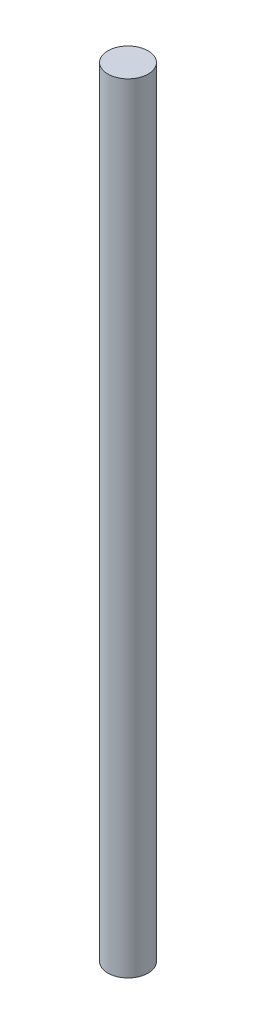
ISO-10303-21;
HEADER;
FILE_DESCRIPTION(('STEP AP214'),'2;1');
FILE_NAME('part.step','',(''),(''),'','','');
FILE_SCHEMA(('AUTOMOTIVE_DESIGN { 1 0 10303 214 1 1 1 1 }'));
ENDSEC;
DATA;
#1=APPLICATION_CONTEXT('core data for automotive mechanical design processes');
#2=APPLICATION_PROTOCOL_DEFINITION('international standard','automotive_design',2000,#1);
#3=PRODUCT_CONTEXT('',#1,'mechanical');
#4=PRODUCT('Part','Part','',(#3));
#5=PRODUCT_RELATED_PRODUCT_CATEGORY('part','',(#4));
#6=PRODUCT_DEFINITION_FORMATION('','',#4);
#7=PRODUCT_DEFINITION_CONTEXT('part definition',#1,'design');
#8=PRODUCT_DEFINITION('design','',#6,#7);
#9=PRODUCT_DEFINITION_SHAPE('','',#8);
#10=(LENGTH_UNIT() NAMED_UNIT(*) SI_UNIT(.MILLI.,.METRE.));
#11=(NAMED_UNIT(*) PLANE_ANGLE_UNIT() SI_UNIT($,.RADIAN.));
#12=(NAMED_UNIT(*) SI_UNIT($,.STERADIAN.) SOLID_ANGLE_UNIT());
#13=UNCERTAINTY_MEASURE_WITH_UNIT(LENGTH_MEASURE(1.E-05),#10,'distance_accuracy_value','');
#14=(GEOMETRIC_REPRESENTATION_CONTEXT(3) GLOBAL_UNCERTAINTY_ASSIGNED_CONTEXT((#13)) GLOBAL_UNIT_ASSIGNED_CONTEXT((#10,
#11,#12)) REPRESENTATION_CONTEXT('',''));
#15=CARTESIAN_POINT('',(0.,0.,0.));
#16=DIRECTION('',(0.,0.,1.));
#17=DIRECTION('',(1.,0.,0.));
#18=AXIS2_PLACEMENT_3D('',#15,#16,#17);
#19=CARTESIAN_POINT('',(0.,870.,0.));
#20=DIRECTION('',(0.,-1.,0.));
#21=DIRECTION('',(0.,0.,-1.));
#22=AXIS2_PLACEMENT_3D('',#19,#20,#21);
#23=CYLINDRICAL_SURFACE('',#22,22.5);
#24=CARTESIAN_POINT('',(0.,870.,0.));
#25=DIRECTION('',(0.,1.,0.));
#26=DIRECTION('',(0.,0.,1.));
#27=AXIS2_PLACEMENT_3D('',#24,#25,#26);
#28=CIRCLE('',#27,22.5);
#29=CARTESIAN_POINT('',(0.,870.,-22.5));
#30=VERTEX_POINT('',#29);
#31=EDGE_CURVE('E12',#30,#30,#28,.T.);
#32=CARTESIAN_POINT('',(0.,0.,0.));
#33=DIRECTION('',(0.,1.,0.));
#34=DIRECTION('',(0.,0.,1.));
#35=AXIS2_PLACEMENT_3D('',#32,#33,#34);
#36=CIRCLE('',#35,22.5);
#37=CARTESIAN_POINT('',(0.,-1.11022302462516E-13,-22.5));
#38=VERTEX_POINT('',#37);
#39=EDGE_CURVE('E45',#38,#38,#36,.T.);
#40=CARTESIAN_POINT('',(0.,870.,-22.5));
#41=CARTESIAN_POINT('',(0.,860.9375,-22.5));
#42=CARTESIAN_POINT('',(0.,851.875,-22.5));
#43=CARTESIAN_POINT('',(0.,833.75,-22.5));
#44=CARTESIAN_POINT('',(0.,824.6875,-22.5));
#45=CARTESIAN_POINT('',(0.,806.5625,-22.5));
#46=CARTESIAN_POINT('',(0.,797.5,-22.5));
#47=CARTESIAN_POINT('',(0.,779.375,-22.5));
#48=CARTESIAN_POINT('',(0.,770.3125,-22.5));
#49=CARTESIAN_POINT('',(0.,752.1875,-22.5));
#50=CARTESIAN_POINT('',(0.,743.125,-22.5));
#51=CARTESIAN_POINT('',(0.,725.,-22.5));
#52=CARTESIAN_POINT('',(0.,715.9375,-22.5));
#53=CARTESIAN_POINT('',(0.,697.8125,-22.5));
#54=CARTESIAN_POINT('',(0.,688.75,-22.5));
#55=CARTESIAN_POINT('',(0.,670.625,-22.5));
#56=CARTESIAN_POINT('',(0.,661.5625,-22.5));
#57=CARTESIAN_POINT('',(0.,643.4375,-22.5));
#58=CARTESIAN_POINT('',(0.,634.375,-22.5));
#59=CARTESIAN_POINT('',(0.,616.25,-22.5));
#60=CARTESIAN_POINT('',(0.,607.1875,-22.5));
#61=CARTESIAN_POINT('',(0.,589.0625,-22.5));
#62=CARTESIAN_POINT('',(0.,580.,-22.5));
#63=CARTESIAN_POINT('',(0.,561.875,-22.5));
#64=CARTESIAN_POINT('',(0.,552.8125,-22.5));
#65=CARTESIAN_POINT('',(0.,534.6875,-22.5));
#66=CARTESIAN_POINT('',(0.,525.625,-22.5));
#67=CARTESIAN_POINT('',(0.,507.5,-22.5));
#68=CARTESIAN_POINT('',(0.,498.4375,-22.5));
#69=CARTESIAN_POINT('',(0.,480.3125,-22.5));
#70=CARTESIAN_POINT('',(0.,471.25,-22.5));
#71=CARTESIAN_POINT('',(0.,453.125,-22.5));
#72=CARTESIAN_POINT('',(0.,444.0625,-22.5));
#73=CARTESIAN_POINT('',(0.,425.9375,-22.5));
#74=CARTESIAN_POINT('',(0.,416.875,-22.5));
#75=CARTESIAN_POINT('',(0.,398.75,-22.5));
#76=CARTESIAN_POINT('',(0.,389.6875,-22.5));
#77=CARTESIAN_POINT('',(0.,371.5625,-22.5));
#78=CARTESIAN_POINT('',(0.,362.5,-22.5));
#79=CARTESIAN_POINT('',(0.,344.375,-22.5));
#80=CARTESIAN_POINT('',(0.,335.3125,-22.5));
#81=CARTESIAN_POINT('',(0.,317.1875,-22.5));
#82=CARTESIAN_POINT('',(0.,308.125,-22.5));
#83=CARTESIAN_POINT('',(0.,290.,-22.5));
#84=CARTESIAN_POINT('',(0.,280.9375,-22.5));
#85=CARTESIAN_POINT('',(0.,262.8125,-22.5));
#86=CARTESIAN_POINT('',(0.,253.75,-22.5));
#87=CARTESIAN_POINT('',(0.,235.625,-22.5));
#88=CARTESIAN_POINT('',(0.,226.5625,-22.5));
#89=CARTESIAN_POINT('',(0.,208.4375,-22.5));
#90=CARTESIAN_POINT('',(0.,199.375,-22.5));
#91=CARTESIAN_POINT('',(0.,181.25,-22.5));
#92=CARTESIAN_POINT('',(0.,172.1875,-22.5));
#93=CARTESIAN_POINT('',(0.,154.0625,-22.5));
#94=CARTESIAN_POINT('',(0.,145.,-22.5));
#95=CARTESIAN_POINT('',(0.,126.875,-22.5));
#96=CARTESIAN_POINT('',(0.,117.8125,-22.5));
#97=CARTESIAN_POINT('',(0.,99.6874999999999,-22.5));
#98=CARTESIAN_POINT('',(0.,90.6249999999999,-22.5));
#99=CARTESIAN_POINT('',(0.,72.4999999999999,-22.5));
#100=CARTESIAN_POINT('',(0.,63.4374999999999,-22.5));
#101=CARTESIAN_POINT('',(0.,45.3124999999999,-22.5));
#102=CARTESIAN_POINT('',(0.,36.2499999999999,-22.5));
#103=CARTESIAN_POINT('',(0.,18.1249999999999,-22.5));
#104=CARTESIAN_POINT('',(0.,9.0624999999999,-22.5));
#105=CARTESIAN_POINT('',(0.,-1.11022302462516E-13,-22.5));
#106=B_SPLINE_CURVE_WITH_KNOTS('',3,(#40,#41,#42,#43,#44,#45,#46,#47,#48,#49,#50,#51,#52,#53,
#54,#55,#56,#57,#58,#59,#60,#61,#62,#63,#64,#65,#66,#67,#68,#69,#70,#71,#72,#73,#74,#75,#76,#77,
#78,#79,#80,#81,#82,#83,#84,#85,#86,#87,#88,#89,#90,#91,#92,#93,#94,#95,#96,#97,#98,#99,#100,
#101,#102,#103,#104,#105),.UNSPECIFIED.,.F.,.F.,(4,2,2,2,2,2,2,2,2,2,2,2,2,2,2,2,2,2,2,2,2,2,2,
2,2,2,2,2,2,2,2,2,4),(0.,27.1874999999999,54.375,81.5624999999999,108.75,135.9375,163.125,
190.3125,217.5,244.6875,271.875,299.0625,326.25,353.4375,380.625,407.8125,435.,462.1875,489.375,
516.5625,543.75,570.9375,598.125,625.3125,652.5,679.6875,706.875,734.0625,761.25,788.4375,
815.625,842.8125,870.),.UNSPECIFIED.);
#107=EDGE_CURVE('BSEAM42',#30,#38,#106,.T.);
#108=ORIENTED_EDGE('',*,*,#31,.F.);
#109=ORIENTED_EDGE('',*,*,#39,.T.);
#110=ORIENTED_EDGE('',*,*,#107,.T.);
#111=ORIENTED_EDGE('',*,*,#107,.F.);
#112=EDGE_LOOP('',(#108,#110,#109,#111));
#113=FACE_BOUND('',#112,.T.);
#114=ADVANCED_FACE('F42',(#113),#23,.T.);
#115=CARTESIAN_POINT('',(0.,870.,0.));
#116=DIRECTION('',(0.,1.,0.));
#117=DIRECTION('',(0.,0.,1.));
#118=AXIS2_PLACEMENT_3D('',#115,#116,#117);
#119=PLANE('',#118);
#120=ORIENTED_EDGE('',*,*,#31,.T.);
#121=EDGE_LOOP('',(#120));
#122=FACE_BOUND('',#121,.T.);
#123=ADVANCED_FACE('F61',(#122),#119,.T.);
#124=CARTESIAN_POINT('',(0.,0.,0.));
#125=DIRECTION('',(0.,1.,0.));
#126=DIRECTION('',(0.,0.,1.));
#127=AXIS2_PLACEMENT_3D('',#124,#125,#126);
#128=PLANE('',#127);
#129=ORIENTED_EDGE('',*,*,#39,.F.);
#130=EDGE_LOOP('',(#129));
#131=FACE_BOUND('',#130,.T.);
#132=ADVANCED_FACE('F59',(#131),#128,.F.);
#133=CLOSED_SHELL('',(#114,#123,#132));
#134=MANIFOLD_SOLID_BREP('B2',#133);
#135=ADVANCED_BREP_SHAPE_REPRESENTATION('',(#18,#134),#14);
#136=SHAPE_DEFINITION_REPRESENTATION(#9,#135);
ENDSEC;
END-ISO-10303-21;
